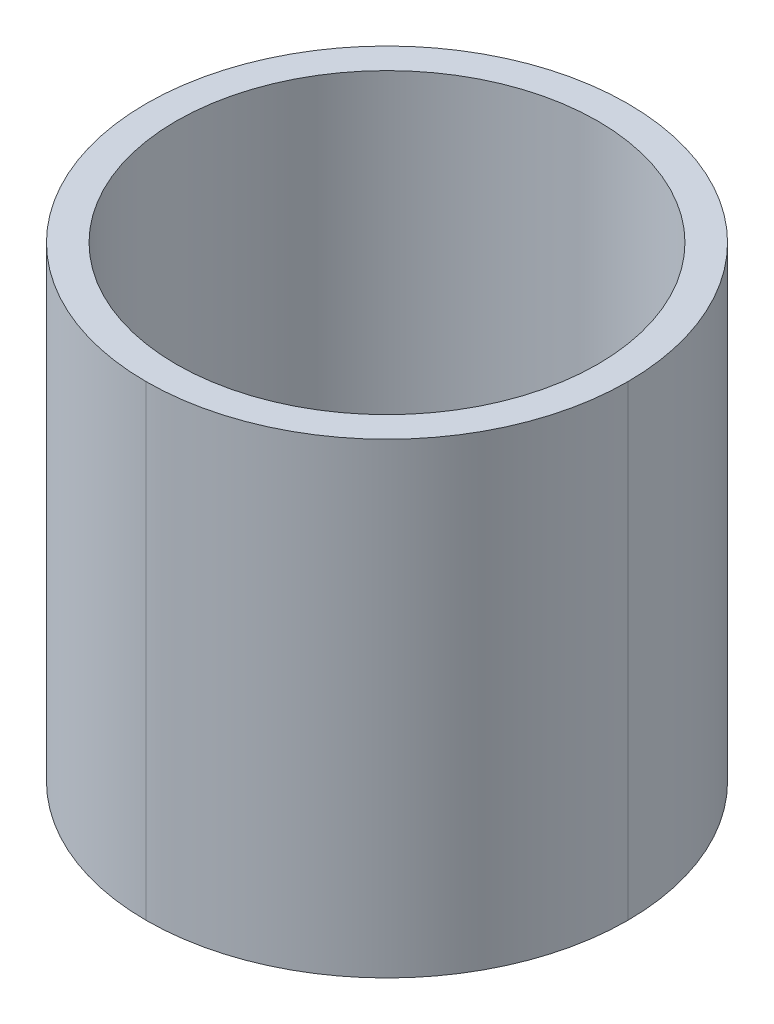
ISO-10303-21;
HEADER;
FILE_DESCRIPTION(('STEP AP214'),'2;1');
FILE_NAME('part.step','',(''),(''),'','','');
FILE_SCHEMA(('AUTOMOTIVE_DESIGN { 1 0 10303 214 1 1 1 1 }'));
ENDSEC;
DATA;
#1=APPLICATION_CONTEXT('core data for automotive mechanical design processes');
#2=APPLICATION_PROTOCOL_DEFINITION('international standard','automotive_design',2000,#1);
#3=PRODUCT_CONTEXT('',#1,'mechanical');
#4=PRODUCT('Part','Part','',(#3));
#5=PRODUCT_RELATED_PRODUCT_CATEGORY('part','',(#4));
#6=PRODUCT_DEFINITION_FORMATION('','',#4);
#7=PRODUCT_DEFINITION_CONTEXT('part definition',#1,'design');
#8=PRODUCT_DEFINITION('design','',#6,#7);
#9=PRODUCT_DEFINITION_SHAPE('','',#8);
#10=(LENGTH_UNIT() NAMED_UNIT(*) SI_UNIT(.MILLI.,.METRE.));
#11=(NAMED_UNIT(*) PLANE_ANGLE_UNIT() SI_UNIT($,.RADIAN.));
#12=(NAMED_UNIT(*) SI_UNIT($,.STERADIAN.) SOLID_ANGLE_UNIT());
#13=UNCERTAINTY_MEASURE_WITH_UNIT(LENGTH_MEASURE(1.E-05),#10,'distance_accuracy_value','');
#14=(GEOMETRIC_REPRESENTATION_CONTEXT(3) GLOBAL_UNCERTAINTY_ASSIGNED_CONTEXT((#13)) GLOBAL_UNIT_ASSIGNED_CONTEXT((#10,
#11,#12)) REPRESENTATION_CONTEXT('',''));
#15=CARTESIAN_POINT('',(0.,0.,0.));
#16=DIRECTION('',(0.,0.,1.));
#17=DIRECTION('',(1.,0.,0.));
#18=AXIS2_PLACEMENT_3D('',#15,#16,#17);
#19=CARTESIAN_POINT('',(0.,98.425,0.));
#20=DIRECTION('',(0.,1.,0.));
#21=DIRECTION('',(0.,0.,1.));
#22=AXIS2_PLACEMENT_3D('',#19,#20,#21);
#23=PLANE('',#22);
#24=CARTESIAN_POINT('',(50.8,98.425,50.8));
#25=DIRECTION('',(0.,1.,0.));
#26=DIRECTION('',(0.,0.,1.));
#27=AXIS2_PLACEMENT_3D('',#24,#25,#26);
#28=CIRCLE('',#27,44.45);
#29=CARTESIAN_POINT('',(50.8,98.425,95.25));
#30=VERTEX_POINT('',#29);
#31=EDGE_CURVE('E120',#30,#30,#28,.T.);
#32=ORIENTED_EDGE('',*,*,#31,.F.);
#33=EDGE_LOOP('',(#32));
#34=FACE_BOUND('',#33,.T.);
#35=CARTESIAN_POINT('',(50.8,98.425,50.8));
#36=DIRECTION('',(0.,1.,0.));
#37=DIRECTION('',(0.,0.,1.));
#38=AXIS2_PLACEMENT_3D('',#35,#36,#37);
#39=CIRCLE('',#38,50.8);
#40=CARTESIAN_POINT('',(50.8,98.425,0.));
#41=VERTEX_POINT('',#40);
#42=CARTESIAN_POINT('',(0.,98.425,50.8));
#43=VERTEX_POINT('',#42);
#44=EDGE_CURVE('E43',#41,#43,#39,.T.);
#45=ORIENTED_EDGE('',*,*,#44,.T.);
#46=CARTESIAN_POINT('',(50.8,98.425,50.8));
#47=DIRECTION('',(0.,1.,0.));
#48=DIRECTION('',(0.,0.,1.));
#49=AXIS2_PLACEMENT_3D('',#46,#47,#48);
#50=CIRCLE('',#49,50.8);
#51=CARTESIAN_POINT('',(50.8,98.425,101.6));
#52=VERTEX_POINT('',#51);
#53=EDGE_CURVE('E11',#43,#52,#50,.T.);
#54=ORIENTED_EDGE('',*,*,#53,.T.);
#55=CARTESIAN_POINT('',(50.8,98.425,50.8));
#56=DIRECTION('',(0.,1.,0.));
#57=DIRECTION('',(0.,0.,1.));
#58=AXIS2_PLACEMENT_3D('',#55,#56,#57);
#59=CIRCLE('',#58,50.8);
#60=CARTESIAN_POINT('',(101.6,98.425,50.8));
#61=VERTEX_POINT('',#60);
#62=EDGE_CURVE('E55',#52,#61,#59,.T.);
#63=ORIENTED_EDGE('',*,*,#62,.T.);
#64=CARTESIAN_POINT('',(50.8,98.425,50.8));
#65=DIRECTION('',(0.,1.,0.));
#66=DIRECTION('',(0.,0.,1.));
#67=AXIS2_PLACEMENT_3D('',#64,#65,#66);
#68=CIRCLE('',#67,50.8);
#69=EDGE_CURVE('E51',#61,#41,#68,.T.);
#70=ORIENTED_EDGE('',*,*,#69,.T.);
#71=EDGE_LOOP('',(#45,#54,#63,#70));
#72=FACE_BOUND('',#71,.T.);
#73=ADVANCED_FACE('F34',(#34,#72),#23,.T.);
#74=CARTESIAN_POINT('',(0.,0.,0.));
#75=DIRECTION('',(0.,1.,0.));
#76=DIRECTION('',(0.,0.,1.));
#77=AXIS2_PLACEMENT_3D('',#74,#75,#76);
#78=PLANE('',#77);
#79=CARTESIAN_POINT('',(50.8,0.,50.8));
#80=DIRECTION('',(0.,1.,0.));
#81=DIRECTION('',(0.,0.,1.));
#82=AXIS2_PLACEMENT_3D('',#79,#80,#81);
#83=CIRCLE('',#82,50.8);
#84=CARTESIAN_POINT('',(101.6,0.,50.8));
#85=VERTEX_POINT('',#84);
#86=CARTESIAN_POINT('',(50.8,0.,101.6));
#87=VERTEX_POINT('',#86);
#88=EDGE_CURVE('E95',#85,#87,#83,.F.);
#89=ORIENTED_EDGE('',*,*,#88,.T.);
#90=CARTESIAN_POINT('',(50.8,0.,50.8));
#91=DIRECTION('',(0.,1.,0.));
#92=DIRECTION('',(0.,0.,1.));
#93=AXIS2_PLACEMENT_3D('',#90,#91,#92);
#94=CIRCLE('',#93,50.8);
#95=CARTESIAN_POINT('',(0.,0.,50.8));
#96=VERTEX_POINT('',#95);
#97=EDGE_CURVE('E80',#87,#96,#94,.F.);
#98=ORIENTED_EDGE('',*,*,#97,.T.);
#99=CARTESIAN_POINT('',(50.8,0.,50.8));
#100=DIRECTION('',(0.,1.,0.));
#101=DIRECTION('',(0.,0.,1.));
#102=AXIS2_PLACEMENT_3D('',#99,#100,#101);
#103=CIRCLE('',#102,50.8);
#104=CARTESIAN_POINT('',(50.8,0.,0.));
#105=VERTEX_POINT('',#104);
#106=EDGE_CURVE('E87',#96,#105,#103,.F.);
#107=ORIENTED_EDGE('',*,*,#106,.T.);
#108=CARTESIAN_POINT('',(50.8,0.,50.8));
#109=DIRECTION('',(0.,1.,0.));
#110=DIRECTION('',(0.,0.,1.));
#111=AXIS2_PLACEMENT_3D('',#108,#109,#110);
#112=CIRCLE('',#111,50.8);
#113=EDGE_CURVE('E91',#105,#85,#112,.F.);
#114=ORIENTED_EDGE('',*,*,#113,.T.);
#115=EDGE_LOOP('',(#89,#98,#107,#114));
#116=FACE_BOUND('',#115,.T.);
#117=ADVANCED_FACE('F93',(#116),#78,.F.);
#118=CARTESIAN_POINT('',(50.8,28.575,50.8));
#119=DIRECTION('',(0.,1.,0.));
#120=DIRECTION('',(0.,0.,1.));
#121=AXIS2_PLACEMENT_3D('',#118,#119,#120);
#122=CYLINDRICAL_SURFACE('',#121,44.45);
#123=CARTESIAN_POINT('',(50.8,28.575,50.8));
#124=DIRECTION('',(0.,1.,0.));
#125=DIRECTION('',(0.,0.,1.));
#126=AXIS2_PLACEMENT_3D('',#123,#124,#125);
#127=CIRCLE('',#126,44.45);
#128=CARTESIAN_POINT('',(50.8,28.575,95.25));
#129=VERTEX_POINT('',#128);
#130=EDGE_CURVE('E125',#129,#129,#127,.T.);
#131=ORIENTED_EDGE('',*,*,#130,.F.);
#132=EDGE_LOOP('',(#131));
#133=FACE_BOUND('',#132,.T.);
#134=ORIENTED_EDGE('',*,*,#31,.T.);
#135=EDGE_LOOP('',(#134));
#136=FACE_BOUND('',#135,.T.);
#137=ADVANCED_FACE('F138',(#133,#136),#122,.F.);
#138=CARTESIAN_POINT('',(50.8,28.575,50.8));
#139=DIRECTION('',(0.,1.,0.));
#140=DIRECTION('',(0.,0.,1.));
#141=AXIS2_PLACEMENT_3D('',#138,#139,#140);
#142=PLANE('',#141);
#143=CARTESIAN_POINT('',(25.1367805345212,28.575,50.8));
#144=DIRECTION('',(0.,1.,0.));
#145=DIRECTION('',(0.,0.,1.));
#146=AXIS2_PLACEMENT_3D('',#143,#144,#145);
#147=CIRCLE('',#146,10.16);
#148=CARTESIAN_POINT('',(25.1367805345212,28.575,60.96));
#149=VERTEX_POINT('',#148);
#150=EDGE_CURVE('E113',#149,#149,#147,.T.);
#151=ORIENTED_EDGE('',*,*,#150,.F.);
#152=EDGE_LOOP('',(#151));
#153=FACE_BOUND('',#152,.T.);
#154=CARTESIAN_POINT('',(63.6316097327394,28.575,28.5749999999999));
#155=DIRECTION('',(0.,1.,0.));
#156=DIRECTION('',(0.,0.,1.));
#157=AXIS2_PLACEMENT_3D('',#154,#155,#156);
#158=CIRCLE('',#157,10.16);
#159=CARTESIAN_POINT('',(63.6316097327394,28.575,38.7349999999999));
#160=VERTEX_POINT('',#159);
#161=EDGE_CURVE('E106',#160,#160,#158,.T.);
#162=ORIENTED_EDGE('',*,*,#161,.F.);
#163=EDGE_LOOP('',(#162));
#164=FACE_BOUND('',#163,.T.);
#165=CARTESIAN_POINT('',(63.6316097327395,28.575,73.0249999999999));
#166=DIRECTION('',(0.,1.,0.));
#167=DIRECTION('',(0.,0.,1.));
#168=AXIS2_PLACEMENT_3D('',#165,#166,#167);
#169=CIRCLE('',#168,10.16);
#170=CARTESIAN_POINT('',(63.6316097327395,28.575,83.1849999999999));
#171=VERTEX_POINT('',#170);
#172=EDGE_CURVE('E121',#171,#171,#169,.T.);
#173=ORIENTED_EDGE('',*,*,#172,.F.);
#174=EDGE_LOOP('',(#173));
#175=FACE_BOUND('',#174,.T.);
#176=ORIENTED_EDGE('',*,*,#130,.T.);
#177=EDGE_LOOP('',(#176));
#178=FACE_BOUND('',#177,.T.);
#179=ADVANCED_FACE('F179',(#153,#164,#175,#178),#142,.T.);
#180=CARTESIAN_POINT('',(63.6316097327395,3.175,73.0249999999999));
#181=DIRECTION('',(0.,1.,0.));
#182=DIRECTION('',(0.,0.,1.));
#183=AXIS2_PLACEMENT_3D('',#180,#181,#182);
#184=CYLINDRICAL_SURFACE('',#183,10.16);
#185=CARTESIAN_POINT('',(63.6316097327395,3.175,73.0249999999999));
#186=DIRECTION('',(0.,1.,0.));
#187=DIRECTION('',(0.,0.,1.));
#188=AXIS2_PLACEMENT_3D('',#185,#186,#187);
#189=CIRCLE('',#188,10.16);
#190=CARTESIAN_POINT('',(63.6316097327395,3.175,83.1849999999999));
#191=VERTEX_POINT('',#190);
#192=EDGE_CURVE('E117',#191,#191,#189,.T.);
#193=ORIENTED_EDGE('',*,*,#192,.F.);
#194=EDGE_LOOP('',(#193));
#195=FACE_BOUND('',#194,.T.);
#196=ORIENTED_EDGE('',*,*,#172,.T.);
#197=EDGE_LOOP('',(#196));
#198=FACE_BOUND('',#197,.T.);
#199=ADVANCED_FACE('F176',(#195,#198),#184,.F.);
#200=CARTESIAN_POINT('',(63.6316097327395,3.175,73.0249999999999));
#201=DIRECTION('',(0.,1.,0.));
#202=DIRECTION('',(0.,0.,1.));
#203=AXIS2_PLACEMENT_3D('',#200,#201,#202);
#204=PLANE('',#203);
#205=ORIENTED_EDGE('',*,*,#192,.T.);
#206=EDGE_LOOP('',(#205));
#207=FACE_BOUND('',#206,.T.);
#208=ADVANCED_FACE('F172',(#207),#204,.T.);
#209=CARTESIAN_POINT('',(63.6316097327394,3.175,28.5749999999999));
#210=DIRECTION('',(0.,1.,0.));
#211=DIRECTION('',(0.,0.,1.));
#212=AXIS2_PLACEMENT_3D('',#209,#210,#211);
#213=CYLINDRICAL_SURFACE('',#212,10.16);
#214=CARTESIAN_POINT('',(63.6316097327394,3.175,28.5749999999999));
#215=DIRECTION('',(0.,1.,0.));
#216=DIRECTION('',(0.,0.,1.));
#217=AXIS2_PLACEMENT_3D('',#214,#215,#216);
#218=CIRCLE('',#217,10.16);
#219=CARTESIAN_POINT('',(63.6316097327394,3.175,38.7349999999999));
#220=VERTEX_POINT('',#219);
#221=EDGE_CURVE('E108',#220,#220,#218,.T.);
#222=ORIENTED_EDGE('',*,*,#221,.F.);
#223=EDGE_LOOP('',(#222));
#224=FACE_BOUND('',#223,.T.);
#225=ORIENTED_EDGE('',*,*,#161,.T.);
#226=EDGE_LOOP('',(#225));
#227=FACE_BOUND('',#226,.T.);
#228=ADVANCED_FACE('F168',(#224,#227),#213,.F.);
#229=CARTESIAN_POINT('',(63.6316097327394,3.175,28.5749999999999));
#230=DIRECTION('',(0.,1.,0.));
#231=DIRECTION('',(0.,0.,1.));
#232=AXIS2_PLACEMENT_3D('',#229,#230,#231);
#233=PLANE('',#232);
#234=ORIENTED_EDGE('',*,*,#221,.T.);
#235=EDGE_LOOP('',(#234));
#236=FACE_BOUND('',#235,.T.);
#237=ADVANCED_FACE('F161',(#236),#233,.T.);
#238=CARTESIAN_POINT('',(25.1367805345212,3.175,50.8));
#239=DIRECTION('',(0.,1.,0.));
#240=DIRECTION('',(0.,0.,1.));
#241=AXIS2_PLACEMENT_3D('',#238,#239,#240);
#242=CYLINDRICAL_SURFACE('',#241,10.16);
#243=CARTESIAN_POINT('',(25.1367805345212,3.175,50.8));
#244=DIRECTION('',(0.,1.,0.));
#245=DIRECTION('',(0.,0.,1.));
#246=AXIS2_PLACEMENT_3D('',#243,#244,#245);
#247=CIRCLE('',#246,10.16);
#248=CARTESIAN_POINT('',(25.1367805345212,3.175,60.96));
#249=VERTEX_POINT('',#248);
#250=EDGE_CURVE('E124',#249,#249,#247,.T.);
#251=ORIENTED_EDGE('',*,*,#250,.F.);
#252=EDGE_LOOP('',(#251));
#253=FACE_BOUND('',#252,.T.);
#254=ORIENTED_EDGE('',*,*,#150,.T.);
#255=EDGE_LOOP('',(#254));
#256=FACE_BOUND('',#255,.T.);
#257=ADVANCED_FACE('F155',(#253,#256),#242,.F.);
#258=CARTESIAN_POINT('',(25.1367805345212,3.175,50.8));
#259=DIRECTION('',(0.,1.,0.));
#260=DIRECTION('',(0.,0.,1.));
#261=AXIS2_PLACEMENT_3D('',#258,#259,#260);
#262=PLANE('',#261);
#263=ORIENTED_EDGE('',*,*,#250,.T.);
#264=EDGE_LOOP('',(#263));
#265=FACE_BOUND('',#264,.T.);
#266=ADVANCED_FACE('F151',(#265),#262,.T.);
#267=CARTESIAN_POINT('',(50.8,98.425,50.8));
#268=DIRECTION('',(0.,-1.,0.));
#269=DIRECTION('',(0.,0.,-1.));
#270=AXIS2_PLACEMENT_3D('',#267,#268,#269);
#271=CYLINDRICAL_SURFACE('',#270,50.8);
#272=DIRECTION('',(0.,-1.,0.));
#273=VECTOR('',#272,1.);
#274=CARTESIAN_POINT('',(101.6,98.425,50.8));
#275=LINE('',#274,#273);
#276=EDGE_CURVE('E83',#85,#61,#275,.F.);
#277=ORIENTED_EDGE('',*,*,#276,.F.);
#278=ORIENTED_EDGE('',*,*,#113,.F.);
#279=DIRECTION('',(0.,-1.,0.));
#280=VECTOR('',#279,1.);
#281=CARTESIAN_POINT('',(50.8,98.425,0.));
#282=LINE('',#281,#280);
#283=EDGE_CURVE('E38',#41,#105,#282,.T.);
#284=ORIENTED_EDGE('',*,*,#283,.F.);
#285=ORIENTED_EDGE('',*,*,#69,.F.);
#286=EDGE_LOOP('',(#277,#278,#284,#285));
#287=FACE_BOUND('',#286,.T.);
#288=ADVANCED_FACE('F36',(#287),#271,.T.);
#289=CARTESIAN_POINT('',(50.8,98.425,50.8));
#290=DIRECTION('',(0.,-1.,0.));
#291=DIRECTION('',(0.,0.,-1.));
#292=AXIS2_PLACEMENT_3D('',#289,#290,#291);
#293=CYLINDRICAL_SURFACE('',#292,50.8);
#294=ORIENTED_EDGE('',*,*,#283,.T.);
#295=ORIENTED_EDGE('',*,*,#106,.F.);
#296=DIRECTION('',(0.,-1.,0.));
#297=VECTOR('',#296,1.);
#298=CARTESIAN_POINT('',(0.,98.425,50.8));
#299=LINE('',#298,#297);
#300=EDGE_CURVE('E76',#43,#96,#299,.T.);
#301=ORIENTED_EDGE('',*,*,#300,.F.);
#302=ORIENTED_EDGE('',*,*,#44,.F.);
#303=EDGE_LOOP('',(#294,#295,#301,#302));
#304=FACE_BOUND('',#303,.T.);
#305=ADVANCED_FACE('F88',(#304),#293,.T.);
#306=CARTESIAN_POINT('',(50.8,98.425,50.8));
#307=DIRECTION('',(0.,-1.,0.));
#308=DIRECTION('',(0.,0.,-1.));
#309=AXIS2_PLACEMENT_3D('',#306,#307,#308);
#310=CYLINDRICAL_SURFACE('',#309,50.8);
#311=ORIENTED_EDGE('',*,*,#276,.T.);
#312=ORIENTED_EDGE('',*,*,#62,.F.);
#313=DIRECTION('',(0.,-1.,0.));
#314=VECTOR('',#313,1.);
#315=CARTESIAN_POINT('',(50.8,98.425,101.6));
#316=LINE('',#315,#314);
#317=EDGE_CURVE('E84',#87,#52,#316,.F.);
#318=ORIENTED_EDGE('',*,*,#317,.F.);
#319=ORIENTED_EDGE('',*,*,#88,.F.);
#320=EDGE_LOOP('',(#311,#312,#318,#319));
#321=FACE_BOUND('',#320,.T.);
#322=ADVANCED_FACE('F131',(#321),#310,.T.);
#323=CARTESIAN_POINT('',(50.8,98.425,50.8));
#324=DIRECTION('',(0.,-1.,0.));
#325=DIRECTION('',(0.,0.,-1.));
#326=AXIS2_PLACEMENT_3D('',#323,#324,#325);
#327=CYLINDRICAL_SURFACE('',#326,50.8);
#328=ORIENTED_EDGE('',*,*,#53,.F.);
#329=ORIENTED_EDGE('',*,*,#300,.T.);
#330=ORIENTED_EDGE('',*,*,#97,.F.);
#331=ORIENTED_EDGE('',*,*,#317,.T.);
#332=EDGE_LOOP('',(#328,#329,#330,#331));
#333=FACE_BOUND('',#332,.T.);
#334=ADVANCED_FACE('F78',(#333),#327,.T.);
#335=CLOSED_SHELL('',(#73,#117,#137,#179,#199,#208,#228,#237,#257,#266,#288,#305,#322,#334));
#336=MANIFOLD_SOLID_BREP('B2',#335);
#337=ADVANCED_BREP_SHAPE_REPRESENTATION('',(#18,#336),#14);
#338=SHAPE_DEFINITION_REPRESENTATION(#9,#337);
ENDSEC;
END-ISO-10303-21;
